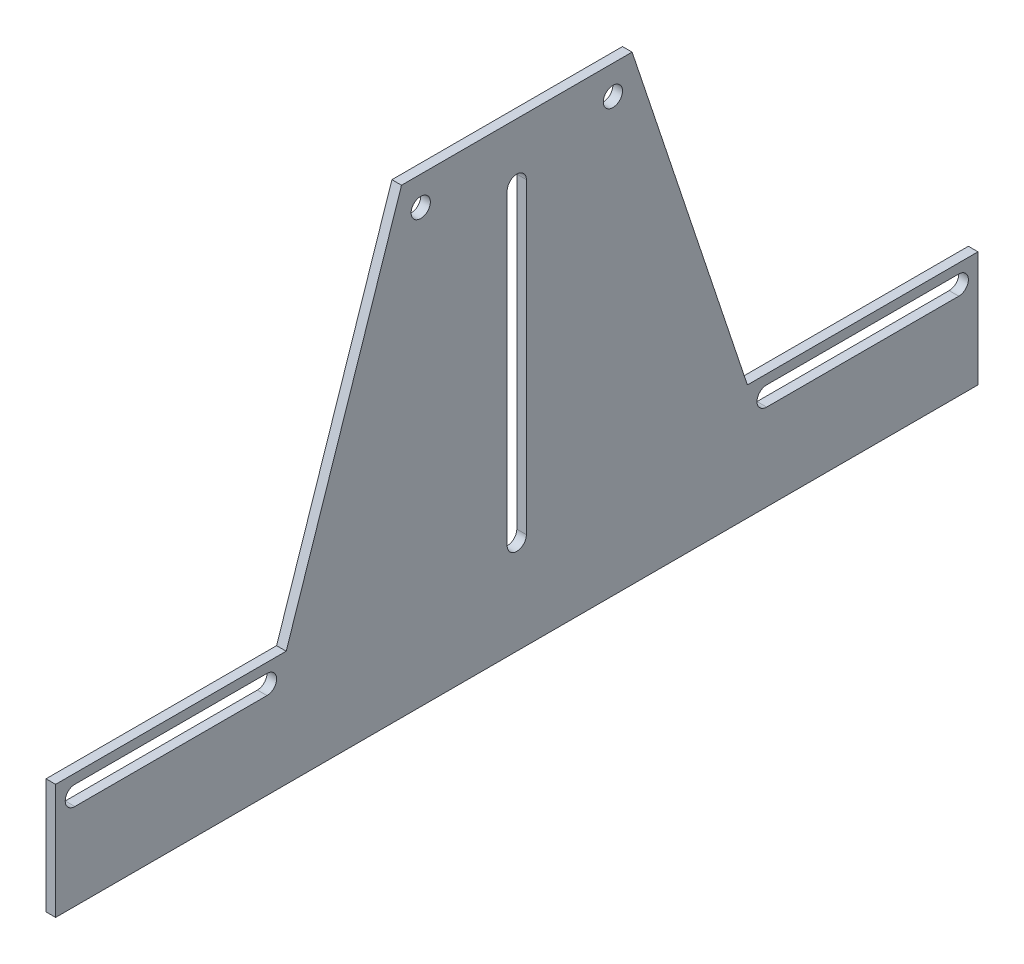
ISO-10303-21;
HEADER;
FILE_DESCRIPTION(('STEP AP214'),'2;1');
FILE_NAME('part.step','',(''),(''),'','','');
FILE_SCHEMA(('AUTOMOTIVE_DESIGN { 1 0 10303 214 1 1 1 1 }'));
ENDSEC;
DATA;
#1=APPLICATION_CONTEXT('core data for automotive mechanical design processes');
#2=APPLICATION_PROTOCOL_DEFINITION('international standard','automotive_design',2000,#1);
#3=PRODUCT_CONTEXT('',#1,'mechanical');
#4=PRODUCT('Part','Part','',(#3));
#5=PRODUCT_RELATED_PRODUCT_CATEGORY('part','',(#4));
#6=PRODUCT_DEFINITION_FORMATION('','',#4);
#7=PRODUCT_DEFINITION_CONTEXT('part definition',#1,'design');
#8=PRODUCT_DEFINITION('design','',#6,#7);
#9=PRODUCT_DEFINITION_SHAPE('','',#8);
#10=(LENGTH_UNIT() NAMED_UNIT(*) SI_UNIT(.MILLI.,.METRE.));
#11=(NAMED_UNIT(*) PLANE_ANGLE_UNIT() SI_UNIT($,.RADIAN.));
#12=(NAMED_UNIT(*) SI_UNIT($,.STERADIAN.) SOLID_ANGLE_UNIT());
#13=UNCERTAINTY_MEASURE_WITH_UNIT(LENGTH_MEASURE(1.E-05),#10,'distance_accuracy_value','');
#14=(GEOMETRIC_REPRESENTATION_CONTEXT(3) GLOBAL_UNCERTAINTY_ASSIGNED_CONTEXT((#13)) GLOBAL_UNIT_ASSIGNED_CONTEXT((#10,
#11,#12)) REPRESENTATION_CONTEXT('',''));
#15=CARTESIAN_POINT('',(0.,0.,0.));
#16=DIRECTION('',(0.,0.,1.));
#17=DIRECTION('',(1.,0.,0.));
#18=AXIS2_PLACEMENT_3D('',#15,#16,#17);
#19=CARTESIAN_POINT('',(6.35,0.,-304.8));
#20=DIRECTION('',(-1.,0.,0.));
#21=DIRECTION('',(0.,0.,1.));
#22=AXIS2_PLACEMENT_3D('',#19,#20,#21);
#23=PLANE('',#22);
#24=CARTESIAN_POINT('',(6.35,285.75,63.5));
#25=DIRECTION('',(1.,0.,0.));
#26=DIRECTION('',(0.,0.,-1.));
#27=AXIS2_PLACEMENT_3D('',#24,#25,#26);
#28=CIRCLE('',#27,6.35);
#29=CARTESIAN_POINT('',(6.35,285.75,57.15));
#30=VERTEX_POINT('',#29);
#31=EDGE_CURVE('E198',#30,#30,#28,.T.);
#32=ORIENTED_EDGE('',*,*,#31,.F.);
#33=EDGE_LOOP('',(#32));
#34=FACE_BOUND('',#33,.T.);
#35=CARTESIAN_POINT('',(6.35,63.5,-292.1));
#36=DIRECTION('',(1.,0.,0.));
#37=DIRECTION('',(0.,0.,1.));
#38=AXIS2_PLACEMENT_3D('',#35,#36,#37);
#39=CIRCLE('',#38,6.35000000000006);
#40=CARTESIAN_POINT('',(6.35,57.1499999999999,-292.1));
#41=VERTEX_POINT('',#40);
#42=CARTESIAN_POINT('',(6.35,69.85,-292.1));
#43=VERTEX_POINT('',#42);
#44=EDGE_CURVE('E208',#41,#43,#39,.T.);
#45=ORIENTED_EDGE('',*,*,#44,.F.);
#46=DIRECTION('',(0.,0.,-1.));
#47=VECTOR('',#46,1.);
#48=CARTESIAN_POINT('',(6.35,57.1499999999999,-292.1));
#49=LINE('',#48,#47);
#50=CARTESIAN_POINT('',(6.35,57.1499999999999,-165.1));
#51=VERTEX_POINT('',#50);
#52=EDGE_CURVE('E216',#51,#41,#49,.T.);
#53=ORIENTED_EDGE('',*,*,#52,.F.);
#54=CARTESIAN_POINT('',(6.35,63.5,-165.1));
#55=DIRECTION('',(1.,0.,0.));
#56=DIRECTION('',(0.,0.,1.));
#57=AXIS2_PLACEMENT_3D('',#54,#55,#56);
#58=CIRCLE('',#57,6.35000000000005);
#59=CARTESIAN_POINT('',(6.35,69.85,-165.1));
#60=VERTEX_POINT('',#59);
#61=EDGE_CURVE('E213',#60,#51,#58,.T.);
#62=ORIENTED_EDGE('',*,*,#61,.F.);
#63=DIRECTION('',(0.,0.,1.));
#64=VECTOR('',#63,1.);
#65=CARTESIAN_POINT('',(6.35,69.85,-292.1));
#66=LINE('',#65,#64);
#67=EDGE_CURVE('E210',#43,#60,#66,.T.);
#68=ORIENTED_EDGE('',*,*,#67,.F.);
#69=EDGE_LOOP('',(#45,#53,#62,#68));
#70=FACE_BOUND('',#69,.T.);
#71=DIRECTION('',(0.,1.,0.));
#72=VECTOR('',#71,1.);
#73=CARTESIAN_POINT('',(6.35,76.2,-304.8));
#74=LINE('',#73,#72);
#75=CARTESIAN_POINT('',(6.35,0.,-304.8));
#76=VERTEX_POINT('',#75);
#77=CARTESIAN_POINT('',(6.35,76.2,-304.8));
#78=VERTEX_POINT('',#77);
#79=EDGE_CURVE('E270',#76,#78,#74,.T.);
#80=ORIENTED_EDGE('',*,*,#79,.T.);
#81=DIRECTION('',(0.,0.,1.));
#82=VECTOR('',#81,1.);
#83=CARTESIAN_POINT('',(6.35,76.2,-152.4));
#84=LINE('',#83,#82);
#85=CARTESIAN_POINT('',(6.35,76.2,-152.4));
#86=VERTEX_POINT('',#85);
#87=EDGE_CURVE('E273',#78,#86,#84,.T.);
#88=ORIENTED_EDGE('',*,*,#87,.T.);
#89=DIRECTION('',(0.,0.948683298050514,0.316227766016838));
#90=VECTOR('',#89,1.);
#91=CARTESIAN_POINT('',(6.35,304.8,-76.2));
#92=LINE('',#91,#90);
#93=CARTESIAN_POINT('',(6.35,304.8,-76.2));
#94=VERTEX_POINT('',#93);
#95=EDGE_CURVE('E276',#86,#94,#92,.T.);
#96=ORIENTED_EDGE('',*,*,#95,.T.);
#97=DIRECTION('',(0.,0.,1.));
#98=VECTOR('',#97,1.);
#99=CARTESIAN_POINT('',(6.35,304.8,76.2));
#100=LINE('',#99,#98);
#101=CARTESIAN_POINT('',(6.35,304.8,76.2));
#102=VERTEX_POINT('',#101);
#103=EDGE_CURVE('E278',#94,#102,#100,.T.);
#104=ORIENTED_EDGE('',*,*,#103,.T.);
#105=DIRECTION('',(0.,-0.948683298050514,0.316227766016838));
#106=VECTOR('',#105,1.);
#107=CARTESIAN_POINT('',(6.35,76.1999999999999,152.4));
#108=LINE('',#107,#106);
#109=CARTESIAN_POINT('',(6.35,76.1999999999999,152.4));
#110=VERTEX_POINT('',#109);
#111=EDGE_CURVE('E280',#102,#110,#108,.T.);
#112=ORIENTED_EDGE('',*,*,#111,.T.);
#113=DIRECTION('',(0.,0.,1.));
#114=VECTOR('',#113,1.);
#115=CARTESIAN_POINT('',(6.35,76.1999999999999,304.8));
#116=LINE('',#115,#114);
#117=CARTESIAN_POINT('',(6.35,76.1999999999999,304.8));
#118=VERTEX_POINT('',#117);
#119=EDGE_CURVE('E282',#110,#118,#116,.T.);
#120=ORIENTED_EDGE('',*,*,#119,.T.);
#121=DIRECTION('',(0.,-1.,0.));
#122=VECTOR('',#121,1.);
#123=CARTESIAN_POINT('',(6.35,0.,304.8));
#124=LINE('',#123,#122);
#125=CARTESIAN_POINT('',(6.35,0.,304.8));
#126=VERTEX_POINT('',#125);
#127=EDGE_CURVE('E284',#118,#126,#124,.T.);
#128=ORIENTED_EDGE('',*,*,#127,.T.);
#129=DIRECTION('',(0.,0.,-1.));
#130=VECTOR('',#129,1.);
#131=CARTESIAN_POINT('',(6.35,0.,-304.8));
#132=LINE('',#131,#130);
#133=EDGE_CURVE('E286',#126,#76,#132,.T.);
#134=ORIENTED_EDGE('',*,*,#133,.T.);
#135=EDGE_LOOP('',(#80,#88,#96,#104,#112,#120,#128,#134));
#136=FACE_BOUND('',#135,.T.);
#137=CARTESIAN_POINT('',(6.35,63.4999999999999,292.1));
#138=DIRECTION('',(1.,0.,0.));
#139=DIRECTION('',(0.,0.,-1.));
#140=AXIS2_PLACEMENT_3D('',#137,#138,#139);
#141=CIRCLE('',#140,6.35000000000006);
#142=CARTESIAN_POINT('',(6.35,69.8499999999999,292.1));
#143=VERTEX_POINT('',#142);
#144=CARTESIAN_POINT('',(6.35,57.1499999999998,292.1));
#145=VERTEX_POINT('',#144);
#146=EDGE_CURVE('E239',#143,#145,#141,.T.);
#147=ORIENTED_EDGE('',*,*,#146,.F.);
#148=DIRECTION('',(0.,0.,1.));
#149=VECTOR('',#148,1.);
#150=CARTESIAN_POINT('',(6.35,69.8499999999999,292.1));
#151=LINE('',#150,#149);
#152=CARTESIAN_POINT('',(6.35,69.8499999999999,165.1));
#153=VERTEX_POINT('',#152);
#154=EDGE_CURVE('E247',#153,#143,#151,.T.);
#155=ORIENTED_EDGE('',*,*,#154,.F.);
#156=CARTESIAN_POINT('',(6.35,63.4999999999999,165.1));
#157=DIRECTION('',(1.,0.,0.));
#158=DIRECTION('',(0.,0.,-1.));
#159=AXIS2_PLACEMENT_3D('',#156,#157,#158);
#160=CIRCLE('',#159,6.35000000000005);
#161=CARTESIAN_POINT('',(6.35,57.1499999999999,165.1));
#162=VERTEX_POINT('',#161);
#163=EDGE_CURVE('E244',#162,#153,#160,.T.);
#164=ORIENTED_EDGE('',*,*,#163,.F.);
#165=DIRECTION('',(0.,0.,-1.));
#166=VECTOR('',#165,1.);
#167=CARTESIAN_POINT('',(6.35,57.1499999999998,292.1));
#168=LINE('',#167,#166);
#169=EDGE_CURVE('E241',#145,#162,#168,.T.);
#170=ORIENTED_EDGE('',*,*,#169,.F.);
#171=EDGE_LOOP('',(#147,#155,#164,#170));
#172=FACE_BOUND('',#171,.T.);
#173=CARTESIAN_POINT('',(6.35,266.7,0.));
#174=DIRECTION('',(1.,0.,0.));
#175=DIRECTION('',(0.,0.,-1.));
#176=AXIS2_PLACEMENT_3D('',#173,#174,#175);
#177=CIRCLE('',#176,6.35);
#178=CARTESIAN_POINT('',(6.35,266.7,-6.35000000000002));
#179=VERTEX_POINT('',#178);
#180=CARTESIAN_POINT('',(6.35,266.7,6.34999999999998));
#181=VERTEX_POINT('',#180);
#182=EDGE_CURVE('E169',#179,#181,#177,.T.);
#183=ORIENTED_EDGE('',*,*,#182,.F.);
#184=DIRECTION('',(0.,1.,0.));
#185=VECTOR('',#184,1.);
#186=CARTESIAN_POINT('',(6.35,266.7,-6.35000000000002));
#187=LINE('',#186,#185);
#188=CARTESIAN_POINT('',(6.35,63.4999999999999,-6.35000000000007));
#189=VERTEX_POINT('',#188);
#190=EDGE_CURVE('E192',#189,#179,#187,.T.);
#191=ORIENTED_EDGE('',*,*,#190,.F.);
#192=CARTESIAN_POINT('',(6.35,63.4999999999999,0.));
#193=DIRECTION('',(1.,0.,0.));
#194=DIRECTION('',(0.,0.,-1.));
#195=AXIS2_PLACEMENT_3D('',#192,#193,#194);
#196=CIRCLE('',#195,6.35);
#197=CARTESIAN_POINT('',(6.35,63.4999999999999,6.34999999999995));
#198=VERTEX_POINT('',#197);
#199=EDGE_CURVE('E190',#198,#189,#196,.T.);
#200=ORIENTED_EDGE('',*,*,#199,.F.);
#201=DIRECTION('',(0.,-1.,0.));
#202=VECTOR('',#201,1.);
#203=CARTESIAN_POINT('',(6.35,266.7,6.34999999999998));
#204=LINE('',#203,#202);
#205=EDGE_CURVE('E177',#181,#198,#204,.T.);
#206=ORIENTED_EDGE('',*,*,#205,.F.);
#207=EDGE_LOOP('',(#183,#191,#200,#206));
#208=FACE_BOUND('',#207,.T.);
#209=CARTESIAN_POINT('',(6.35,285.75,-63.5));
#210=DIRECTION('',(1.,0.,0.));
#211=DIRECTION('',(0.,0.,1.));
#212=AXIS2_PLACEMENT_3D('',#209,#210,#211);
#213=CIRCLE('',#212,6.34999999999999);
#214=CARTESIAN_POINT('',(6.35,285.75,-57.15));
#215=VERTEX_POINT('',#214);
#216=EDGE_CURVE('E455',#215,#215,#213,.T.);
#217=ORIENTED_EDGE('',*,*,#216,.F.);
#218=EDGE_LOOP('',(#217));
#219=FACE_BOUND('',#218,.T.);
#220=ADVANCED_FACE('F32',(#34,#70,#136,#172,#208,#219),#23,.F.);
#221=CARTESIAN_POINT('',(0.,0.,-304.8));
#222=DIRECTION('',(-1.,0.,0.));
#223=DIRECTION('',(0.,0.,1.));
#224=AXIS2_PLACEMENT_3D('',#221,#222,#223);
#225=PLANE('',#224);
#226=CARTESIAN_POINT('',(0.,285.75,63.5));
#227=DIRECTION('',(1.,0.,0.));
#228=DIRECTION('',(0.,0.,-1.));
#229=AXIS2_PLACEMENT_3D('',#226,#227,#228);
#230=CIRCLE('',#229,6.35);
#231=CARTESIAN_POINT('',(0.,285.75,57.15));
#232=VERTEX_POINT('',#231);
#233=EDGE_CURVE('E461',#232,#232,#230,.T.);
#234=ORIENTED_EDGE('',*,*,#233,.T.);
#235=EDGE_LOOP('',(#234));
#236=FACE_BOUND('',#235,.T.);
#237=DIRECTION('',(0.,0.,-1.));
#238=VECTOR('',#237,1.);
#239=CARTESIAN_POINT('',(0.,57.1499999999999,-292.1));
#240=LINE('',#239,#238);
#241=CARTESIAN_POINT('',(0.,57.1499999999999,-165.1));
#242=VERTEX_POINT('',#241);
#243=CARTESIAN_POINT('',(0.,57.1499999999999,-292.1));
#244=VERTEX_POINT('',#243);
#245=EDGE_CURVE('E211',#242,#244,#240,.T.);
#246=ORIENTED_EDGE('',*,*,#245,.T.);
#247=CARTESIAN_POINT('',(0.,63.5,-292.1));
#248=DIRECTION('',(1.,0.,0.));
#249=DIRECTION('',(0.,0.,1.));
#250=AXIS2_PLACEMENT_3D('',#247,#248,#249);
#251=CIRCLE('',#250,6.35000000000006);
#252=CARTESIAN_POINT('',(0.,69.85,-292.1));
#253=VERTEX_POINT('',#252);
#254=EDGE_CURVE('E185',#244,#253,#251,.T.);
#255=ORIENTED_EDGE('',*,*,#254,.T.);
#256=DIRECTION('',(0.,0.,1.));
#257=VECTOR('',#256,1.);
#258=CARTESIAN_POINT('',(0.,69.85,-292.1));
#259=LINE('',#258,#257);
#260=CARTESIAN_POINT('',(0.,69.85,-165.1));
#261=VERTEX_POINT('',#260);
#262=EDGE_CURVE('E221',#253,#261,#259,.T.);
#263=ORIENTED_EDGE('',*,*,#262,.T.);
#264=CARTESIAN_POINT('',(0.,63.5,-165.1));
#265=DIRECTION('',(1.,0.,0.));
#266=DIRECTION('',(0.,0.,1.));
#267=AXIS2_PLACEMENT_3D('',#264,#265,#266);
#268=CIRCLE('',#267,6.35000000000005);
#269=EDGE_CURVE('E224',#261,#242,#268,.T.);
#270=ORIENTED_EDGE('',*,*,#269,.T.);
#271=EDGE_LOOP('',(#246,#255,#263,#270));
#272=FACE_BOUND('',#271,.T.);
#273=DIRECTION('',(0.,1.,0.));
#274=VECTOR('',#273,1.);
#275=CARTESIAN_POINT('',(0.,76.2,-304.8));
#276=LINE('',#275,#274);
#277=CARTESIAN_POINT('',(0.,0.,-304.8));
#278=VERTEX_POINT('',#277);
#279=CARTESIAN_POINT('',(0.,76.2,-304.8));
#280=VERTEX_POINT('',#279);
#281=EDGE_CURVE('E269',#278,#280,#276,.T.);
#282=ORIENTED_EDGE('',*,*,#281,.F.);
#283=DIRECTION('',(0.,0.,-1.));
#284=VECTOR('',#283,1.);
#285=CARTESIAN_POINT('',(0.,0.,-304.8));
#286=LINE('',#285,#284);
#287=CARTESIAN_POINT('',(0.,0.,304.8));
#288=VERTEX_POINT('',#287);
#289=EDGE_CURVE('E274',#288,#278,#286,.T.);
#290=ORIENTED_EDGE('',*,*,#289,.F.);
#291=DIRECTION('',(0.,-1.,0.));
#292=VECTOR('',#291,1.);
#293=CARTESIAN_POINT('',(0.,0.,304.8));
#294=LINE('',#293,#292);
#295=CARTESIAN_POINT('',(0.,76.1999999999999,304.8));
#296=VERTEX_POINT('',#295);
#297=EDGE_CURVE('E301',#296,#288,#294,.T.);
#298=ORIENTED_EDGE('',*,*,#297,.F.);
#299=DIRECTION('',(0.,0.,1.));
#300=VECTOR('',#299,1.);
#301=CARTESIAN_POINT('',(0.,76.1999999999999,304.8));
#302=LINE('',#301,#300);
#303=CARTESIAN_POINT('',(0.,76.1999999999999,152.4));
#304=VERTEX_POINT('',#303);
#305=EDGE_CURVE('E299',#304,#296,#302,.T.);
#306=ORIENTED_EDGE('',*,*,#305,.F.);
#307=DIRECTION('',(0.,-0.948683298050514,0.316227766016838));
#308=VECTOR('',#307,1.);
#309=CARTESIAN_POINT('',(0.,76.1999999999999,152.4));
#310=LINE('',#309,#308);
#311=CARTESIAN_POINT('',(0.,304.8,76.2));
#312=VERTEX_POINT('',#311);
#313=EDGE_CURVE('E297',#312,#304,#310,.T.);
#314=ORIENTED_EDGE('',*,*,#313,.F.);
#315=DIRECTION('',(0.,0.,1.));
#316=VECTOR('',#315,1.);
#317=CARTESIAN_POINT('',(0.,304.8,76.2));
#318=LINE('',#317,#316);
#319=CARTESIAN_POINT('',(0.,304.8,-76.2));
#320=VERTEX_POINT('',#319);
#321=EDGE_CURVE('E295',#320,#312,#318,.T.);
#322=ORIENTED_EDGE('',*,*,#321,.F.);
#323=DIRECTION('',(0.,0.948683298050514,0.316227766016838));
#324=VECTOR('',#323,1.);
#325=CARTESIAN_POINT('',(0.,304.8,-76.2));
#326=LINE('',#325,#324);
#327=CARTESIAN_POINT('',(0.,76.2,-152.4));
#328=VERTEX_POINT('',#327);
#329=EDGE_CURVE('E293',#328,#320,#326,.T.);
#330=ORIENTED_EDGE('',*,*,#329,.F.);
#331=DIRECTION('',(0.,0.,1.));
#332=VECTOR('',#331,1.);
#333=CARTESIAN_POINT('',(0.,76.2,-152.4));
#334=LINE('',#333,#332);
#335=EDGE_CURVE('E291',#280,#328,#334,.T.);
#336=ORIENTED_EDGE('',*,*,#335,.F.);
#337=EDGE_LOOP('',(#282,#290,#298,#306,#314,#322,#330,#336));
#338=FACE_BOUND('',#337,.T.);
#339=DIRECTION('',(0.,0.,1.));
#340=VECTOR('',#339,1.);
#341=CARTESIAN_POINT('',(0.,69.8499999999999,292.1));
#342=LINE('',#341,#340);
#343=CARTESIAN_POINT('',(0.,69.8499999999999,165.1));
#344=VERTEX_POINT('',#343);
#345=CARTESIAN_POINT('',(0.,69.8499999999999,292.1));
#346=VERTEX_POINT('',#345);
#347=EDGE_CURVE('E242',#344,#346,#342,.T.);
#348=ORIENTED_EDGE('',*,*,#347,.T.);
#349=CARTESIAN_POINT('',(0.,63.4999999999999,292.1));
#350=DIRECTION('',(1.,0.,0.));
#351=DIRECTION('',(0.,0.,-1.));
#352=AXIS2_PLACEMENT_3D('',#349,#350,#351);
#353=CIRCLE('',#352,6.35000000000006);
#354=CARTESIAN_POINT('',(0.,57.1499999999998,292.1));
#355=VERTEX_POINT('',#354);
#356=EDGE_CURVE('E238',#346,#355,#353,.T.);
#357=ORIENTED_EDGE('',*,*,#356,.T.);
#358=DIRECTION('',(0.,0.,-1.));
#359=VECTOR('',#358,1.);
#360=CARTESIAN_POINT('',(0.,57.1499999999998,292.1));
#361=LINE('',#360,#359);
#362=CARTESIAN_POINT('',(0.,57.1499999999999,165.1));
#363=VERTEX_POINT('',#362);
#364=EDGE_CURVE('E252',#355,#363,#361,.T.);
#365=ORIENTED_EDGE('',*,*,#364,.T.);
#366=CARTESIAN_POINT('',(0.,63.4999999999999,165.1));
#367=DIRECTION('',(1.,0.,0.));
#368=DIRECTION('',(0.,0.,-1.));
#369=AXIS2_PLACEMENT_3D('',#366,#367,#368);
#370=CIRCLE('',#369,6.35000000000005);
#371=EDGE_CURVE('E255',#363,#344,#370,.T.);
#372=ORIENTED_EDGE('',*,*,#371,.T.);
#373=EDGE_LOOP('',(#348,#357,#365,#372));
#374=FACE_BOUND('',#373,.T.);
#375=DIRECTION('',(0.,1.,0.));
#376=VECTOR('',#375,1.);
#377=CARTESIAN_POINT('',(0.,266.7,-6.35000000000002));
#378=LINE('',#377,#376);
#379=CARTESIAN_POINT('',(0.,63.4999999999999,-6.35000000000005));
#380=VERTEX_POINT('',#379);
#381=CARTESIAN_POINT('',(0.,266.7,-6.35000000000005));
#382=VERTEX_POINT('',#381);
#383=EDGE_CURVE('E178',#380,#382,#378,.T.);
#384=ORIENTED_EDGE('',*,*,#383,.T.);
#385=CARTESIAN_POINT('',(0.,266.7,0.));
#386=DIRECTION('',(1.,0.,0.));
#387=DIRECTION('',(0.,0.,-1.));
#388=AXIS2_PLACEMENT_3D('',#385,#386,#387);
#389=CIRCLE('',#388,6.35);
#390=CARTESIAN_POINT('',(0.,266.7,6.34999999999998));
#391=VERTEX_POINT('',#390);
#392=EDGE_CURVE('E55',#382,#391,#389,.T.);
#393=ORIENTED_EDGE('',*,*,#392,.T.);
#394=DIRECTION('',(0.,-1.,0.));
#395=VECTOR('',#394,1.);
#396=CARTESIAN_POINT('',(0.,266.7,6.34999999999998));
#397=LINE('',#396,#395);
#398=CARTESIAN_POINT('',(0.,63.4999999999999,6.34999999999995));
#399=VERTEX_POINT('',#398);
#400=EDGE_CURVE('E184',#391,#399,#397,.T.);
#401=ORIENTED_EDGE('',*,*,#400,.T.);
#402=CARTESIAN_POINT('',(0.,63.4999999999999,0.));
#403=DIRECTION('',(1.,0.,0.));
#404=DIRECTION('',(0.,0.,-1.));
#405=AXIS2_PLACEMENT_3D('',#402,#403,#404);
#406=CIRCLE('',#405,6.35);
#407=EDGE_CURVE('E200',#399,#380,#406,.T.);
#408=ORIENTED_EDGE('',*,*,#407,.T.);
#409=EDGE_LOOP('',(#384,#393,#401,#408));
#410=FACE_BOUND('',#409,.T.);
#411=CARTESIAN_POINT('',(0.,285.75,-63.5));
#412=DIRECTION('',(1.,0.,0.));
#413=DIRECTION('',(0.,0.,1.));
#414=AXIS2_PLACEMENT_3D('',#411,#412,#413);
#415=CIRCLE('',#414,6.34999999999999);
#416=CARTESIAN_POINT('',(0.,285.75,-57.15));
#417=VERTEX_POINT('',#416);
#418=EDGE_CURVE('E458',#417,#417,#415,.T.);
#419=ORIENTED_EDGE('',*,*,#418,.T.);
#420=EDGE_LOOP('',(#419));
#421=FACE_BOUND('',#420,.T.);
#422=ADVANCED_FACE('F331',(#236,#272,#338,#374,#410,#421),#225,.T.);
#423=CARTESIAN_POINT('',(6.35,76.2,-304.8));
#424=DIRECTION('',(0.,0.,1.));
#425=DIRECTION('',(1.,0.,0.));
#426=AXIS2_PLACEMENT_3D('',#423,#424,#425);
#427=PLANE('',#426);
#428=ORIENTED_EDGE('',*,*,#281,.T.);
#429=DIRECTION('',(-1.,0.,0.));
#430=VECTOR('',#429,1.);
#431=CARTESIAN_POINT('',(6.35,76.2,-304.8));
#432=LINE('',#431,#430);
#433=EDGE_CURVE('E11',#78,#280,#432,.T.);
#434=ORIENTED_EDGE('',*,*,#433,.F.);
#435=ORIENTED_EDGE('',*,*,#79,.F.);
#436=DIRECTION('',(-1.,0.,0.));
#437=VECTOR('',#436,1.);
#438=CARTESIAN_POINT('',(6.35,0.,-304.8));
#439=LINE('',#438,#437);
#440=EDGE_CURVE('E288',#76,#278,#439,.T.);
#441=ORIENTED_EDGE('',*,*,#440,.T.);
#442=EDGE_LOOP('',(#428,#434,#435,#441));
#443=FACE_BOUND('',#442,.T.);
#444=ADVANCED_FACE('F34',(#443),#427,.F.);
#445=CARTESIAN_POINT('',(6.35,76.2,-152.4));
#446=DIRECTION('',(0.,-1.,0.));
#447=DIRECTION('',(0.,0.,-1.));
#448=AXIS2_PLACEMENT_3D('',#445,#446,#447);
#449=PLANE('',#448);
#450=ORIENTED_EDGE('',*,*,#335,.T.);
#451=DIRECTION('',(-1.,0.,0.));
#452=VECTOR('',#451,1.);
#453=CARTESIAN_POINT('',(6.35,76.2,-152.4));
#454=LINE('',#453,#452);
#455=EDGE_CURVE('E40',#86,#328,#454,.T.);
#456=ORIENTED_EDGE('',*,*,#455,.F.);
#457=ORIENTED_EDGE('',*,*,#87,.F.);
#458=ORIENTED_EDGE('',*,*,#433,.T.);
#459=EDGE_LOOP('',(#450,#456,#457,#458));
#460=FACE_BOUND('',#459,.T.);
#461=ADVANCED_FACE('F349',(#460),#449,.F.);
#462=CARTESIAN_POINT('',(6.35,304.8,-76.2));
#463=DIRECTION('',(0.,-0.316227766016838,0.948683298050514));
#464=DIRECTION('',(0.,-0.948683298050514,-0.316227766016838));
#465=AXIS2_PLACEMENT_3D('',#462,#463,#464);
#466=PLANE('',#465);
#467=ORIENTED_EDGE('',*,*,#329,.T.);
#468=DIRECTION('',(-1.,0.,0.));
#469=VECTOR('',#468,1.);
#470=CARTESIAN_POINT('',(6.35,304.8,-76.2));
#471=LINE('',#470,#469);
#472=EDGE_CURVE('E318',#94,#320,#471,.T.);
#473=ORIENTED_EDGE('',*,*,#472,.F.);
#474=ORIENTED_EDGE('',*,*,#95,.F.);
#475=ORIENTED_EDGE('',*,*,#455,.T.);
#476=EDGE_LOOP('',(#467,#473,#474,#475));
#477=FACE_BOUND('',#476,.T.);
#478=ADVANCED_FACE('F325',(#477),#466,.F.);
#479=CARTESIAN_POINT('',(6.35,304.8,76.2));
#480=DIRECTION('',(0.,-1.,0.));
#481=DIRECTION('',(0.,0.,-1.));
#482=AXIS2_PLACEMENT_3D('',#479,#480,#481);
#483=PLANE('',#482);
#484=ORIENTED_EDGE('',*,*,#321,.T.);
#485=DIRECTION('',(-1.,0.,0.));
#486=VECTOR('',#485,1.);
#487=CARTESIAN_POINT('',(6.35,304.8,76.2));
#488=LINE('',#487,#486);
#489=EDGE_CURVE('E315',#102,#312,#488,.T.);
#490=ORIENTED_EDGE('',*,*,#489,.F.);
#491=ORIENTED_EDGE('',*,*,#103,.F.);
#492=ORIENTED_EDGE('',*,*,#472,.T.);
#493=EDGE_LOOP('',(#484,#490,#491,#492));
#494=FACE_BOUND('',#493,.T.);
#495=ADVANCED_FACE('F337',(#494),#483,.F.);
#496=CARTESIAN_POINT('',(6.35,76.1999999999999,152.4));
#497=DIRECTION('',(0.,-0.316227766016838,-0.948683298050514));
#498=DIRECTION('',(0.,0.948683298050514,-0.316227766016838));
#499=AXIS2_PLACEMENT_3D('',#496,#497,#498);
#500=PLANE('',#499);
#501=ORIENTED_EDGE('',*,*,#313,.T.);
#502=DIRECTION('',(-1.,0.,0.));
#503=VECTOR('',#502,1.);
#504=CARTESIAN_POINT('',(6.35,76.1999999999999,152.4));
#505=LINE('',#504,#503);
#506=EDGE_CURVE('E312',#110,#304,#505,.T.);
#507=ORIENTED_EDGE('',*,*,#506,.F.);
#508=ORIENTED_EDGE('',*,*,#111,.F.);
#509=ORIENTED_EDGE('',*,*,#489,.T.);
#510=EDGE_LOOP('',(#501,#507,#508,#509));
#511=FACE_BOUND('',#510,.T.);
#512=ADVANCED_FACE('F341',(#511),#500,.F.);
#513=CARTESIAN_POINT('',(6.35,76.1999999999999,304.8));
#514=DIRECTION('',(0.,-1.,0.));
#515=DIRECTION('',(0.,0.,-1.));
#516=AXIS2_PLACEMENT_3D('',#513,#514,#515);
#517=PLANE('',#516);
#518=ORIENTED_EDGE('',*,*,#305,.T.);
#519=DIRECTION('',(-1.,0.,0.));
#520=VECTOR('',#519,1.);
#521=CARTESIAN_POINT('',(6.35,76.1999999999999,304.8));
#522=LINE('',#521,#520);
#523=EDGE_CURVE('E309',#118,#296,#522,.T.);
#524=ORIENTED_EDGE('',*,*,#523,.F.);
#525=ORIENTED_EDGE('',*,*,#119,.F.);
#526=ORIENTED_EDGE('',*,*,#506,.T.);
#527=EDGE_LOOP('',(#518,#524,#525,#526));
#528=FACE_BOUND('',#527,.T.);
#529=ADVANCED_FACE('F362',(#528),#517,.F.);
#530=CARTESIAN_POINT('',(6.35,0.,304.8));
#531=DIRECTION('',(0.,0.,-1.));
#532=DIRECTION('',(-1.,0.,0.));
#533=AXIS2_PLACEMENT_3D('',#530,#531,#532);
#534=PLANE('',#533);
#535=ORIENTED_EDGE('',*,*,#297,.T.);
#536=DIRECTION('',(-1.,0.,0.));
#537=VECTOR('',#536,1.);
#538=CARTESIAN_POINT('',(6.35,0.,304.8));
#539=LINE('',#538,#537);
#540=EDGE_CURVE('E306',#126,#288,#539,.T.);
#541=ORIENTED_EDGE('',*,*,#540,.F.);
#542=ORIENTED_EDGE('',*,*,#127,.F.);
#543=ORIENTED_EDGE('',*,*,#523,.T.);
#544=EDGE_LOOP('',(#535,#541,#542,#543));
#545=FACE_BOUND('',#544,.T.);
#546=ADVANCED_FACE('F360',(#545),#534,.F.);
#547=CARTESIAN_POINT('',(6.35,0.,-304.8));
#548=DIRECTION('',(0.,1.,0.));
#549=DIRECTION('',(0.,0.,1.));
#550=AXIS2_PLACEMENT_3D('',#547,#548,#549);
#551=PLANE('',#550);
#552=ORIENTED_EDGE('',*,*,#289,.T.);
#553=ORIENTED_EDGE('',*,*,#440,.F.);
#554=ORIENTED_EDGE('',*,*,#133,.F.);
#555=ORIENTED_EDGE('',*,*,#540,.T.);
#556=EDGE_LOOP('',(#552,#553,#554,#555));
#557=FACE_BOUND('',#556,.T.);
#558=ADVANCED_FACE('F355',(#557),#551,.F.);
#559=CARTESIAN_POINT('',(6.35,63.4999999999999,292.1));
#560=DIRECTION('',(-1.,0.,0.));
#561=DIRECTION('',(0.,0.,1.));
#562=AXIS2_PLACEMENT_3D('',#559,#560,#561);
#563=CYLINDRICAL_SURFACE('',#562,6.35000000000006);
#564=ORIENTED_EDGE('',*,*,#356,.F.);
#565=DIRECTION('',(-1.,0.,0.));
#566=VECTOR('',#565,1.);
#567=CARTESIAN_POINT('',(6.35,69.8499999999999,292.1));
#568=LINE('',#567,#566);
#569=EDGE_CURVE('E249',#143,#346,#568,.T.);
#570=ORIENTED_EDGE('',*,*,#569,.F.);
#571=ORIENTED_EDGE('',*,*,#146,.T.);
#572=DIRECTION('',(-1.,0.,0.));
#573=VECTOR('',#572,1.);
#574=CARTESIAN_POINT('',(6.35,57.1499999999998,292.1));
#575=LINE('',#574,#573);
#576=EDGE_CURVE('E266',#145,#355,#575,.T.);
#577=ORIENTED_EDGE('',*,*,#576,.T.);
#578=EDGE_LOOP('',(#564,#570,#571,#577));
#579=FACE_BOUND('',#578,.T.);
#580=ADVANCED_FACE('F382',(#579),#563,.F.);
#581=CARTESIAN_POINT('',(6.35,57.1499999999998,292.1));
#582=DIRECTION('',(0.,1.,0.));
#583=DIRECTION('',(0.,0.,1.));
#584=AXIS2_PLACEMENT_3D('',#581,#582,#583);
#585=PLANE('',#584);
#586=ORIENTED_EDGE('',*,*,#364,.F.);
#587=ORIENTED_EDGE('',*,*,#576,.F.);
#588=ORIENTED_EDGE('',*,*,#169,.T.);
#589=DIRECTION('',(-1.,0.,0.));
#590=VECTOR('',#589,1.);
#591=CARTESIAN_POINT('',(6.35,57.1499999999999,165.1));
#592=LINE('',#591,#590);
#593=EDGE_CURVE('E264',#162,#363,#592,.T.);
#594=ORIENTED_EDGE('',*,*,#593,.T.);
#595=EDGE_LOOP('',(#586,#587,#588,#594));
#596=FACE_BOUND('',#595,.T.);
#597=ADVANCED_FACE('F389',(#596),#585,.T.);
#598=CARTESIAN_POINT('',(6.35,63.4999999999999,165.1));
#599=DIRECTION('',(-1.,0.,0.));
#600=DIRECTION('',(0.,0.,1.));
#601=AXIS2_PLACEMENT_3D('',#598,#599,#600);
#602=CYLINDRICAL_SURFACE('',#601,6.35000000000005);
#603=ORIENTED_EDGE('',*,*,#371,.F.);
#604=ORIENTED_EDGE('',*,*,#593,.F.);
#605=ORIENTED_EDGE('',*,*,#163,.T.);
#606=DIRECTION('',(-1.,0.,0.));
#607=VECTOR('',#606,1.);
#608=CARTESIAN_POINT('',(6.35,69.8499999999999,165.1));
#609=LINE('',#608,#607);
#610=EDGE_CURVE('E262',#153,#344,#609,.T.);
#611=ORIENTED_EDGE('',*,*,#610,.T.);
#612=EDGE_LOOP('',(#603,#604,#605,#611));
#613=FACE_BOUND('',#612,.T.);
#614=ADVANCED_FACE('F394',(#613),#602,.F.);
#615=CARTESIAN_POINT('',(6.35,69.8499999999999,292.1));
#616=DIRECTION('',(0.,-1.,0.));
#617=DIRECTION('',(0.,0.,-1.));
#618=AXIS2_PLACEMENT_3D('',#615,#616,#617);
#619=PLANE('',#618);
#620=ORIENTED_EDGE('',*,*,#347,.F.);
#621=ORIENTED_EDGE('',*,*,#610,.F.);
#622=ORIENTED_EDGE('',*,*,#154,.T.);
#623=ORIENTED_EDGE('',*,*,#569,.T.);
#624=EDGE_LOOP('',(#620,#621,#622,#623));
#625=FACE_BOUND('',#624,.T.);
#626=ADVANCED_FACE('F401',(#625),#619,.T.);
#627=CARTESIAN_POINT('',(6.35,63.5,-292.1));
#628=DIRECTION('',(-1.,0.,0.));
#629=DIRECTION('',(0.,0.,1.));
#630=AXIS2_PLACEMENT_3D('',#627,#628,#629);
#631=CYLINDRICAL_SURFACE('',#630,6.35000000000006);
#632=ORIENTED_EDGE('',*,*,#254,.F.);
#633=DIRECTION('',(-1.,0.,0.));
#634=VECTOR('',#633,1.);
#635=CARTESIAN_POINT('',(6.35,57.1499999999999,-292.1));
#636=LINE('',#635,#634);
#637=EDGE_CURVE('E218',#41,#244,#636,.T.);
#638=ORIENTED_EDGE('',*,*,#637,.F.);
#639=ORIENTED_EDGE('',*,*,#44,.T.);
#640=DIRECTION('',(-1.,0.,0.));
#641=VECTOR('',#640,1.);
#642=CARTESIAN_POINT('',(6.35,69.85,-292.1));
#643=LINE('',#642,#641);
#644=EDGE_CURVE('E235',#43,#253,#643,.T.);
#645=ORIENTED_EDGE('',*,*,#644,.T.);
#646=EDGE_LOOP('',(#632,#638,#639,#645));
#647=FACE_BOUND('',#646,.T.);
#648=ADVANCED_FACE('F414',(#647),#631,.F.);
#649=CARTESIAN_POINT('',(6.35,69.85,-292.1));
#650=DIRECTION('',(0.,-1.,0.));
#651=DIRECTION('',(0.,0.,-1.));
#652=AXIS2_PLACEMENT_3D('',#649,#650,#651);
#653=PLANE('',#652);
#654=ORIENTED_EDGE('',*,*,#262,.F.);
#655=ORIENTED_EDGE('',*,*,#644,.F.);
#656=ORIENTED_EDGE('',*,*,#67,.T.);
#657=DIRECTION('',(-1.,0.,0.));
#658=VECTOR('',#657,1.);
#659=CARTESIAN_POINT('',(6.35,69.85,-165.1));
#660=LINE('',#659,#658);
#661=EDGE_CURVE('E233',#60,#261,#660,.T.);
#662=ORIENTED_EDGE('',*,*,#661,.T.);
#663=EDGE_LOOP('',(#654,#655,#656,#662));
#664=FACE_BOUND('',#663,.T.);
#665=ADVANCED_FACE('F419',(#664),#653,.T.);
#666=CARTESIAN_POINT('',(6.35,63.5,-165.1));
#667=DIRECTION('',(-1.,0.,0.));
#668=DIRECTION('',(0.,0.,1.));
#669=AXIS2_PLACEMENT_3D('',#666,#667,#668);
#670=CYLINDRICAL_SURFACE('',#669,6.35000000000005);
#671=ORIENTED_EDGE('',*,*,#269,.F.);
#672=ORIENTED_EDGE('',*,*,#661,.F.);
#673=ORIENTED_EDGE('',*,*,#61,.T.);
#674=DIRECTION('',(-1.,0.,0.));
#675=VECTOR('',#674,1.);
#676=CARTESIAN_POINT('',(6.35,57.1499999999999,-165.1));
#677=LINE('',#676,#675);
#678=EDGE_CURVE('E231',#51,#242,#677,.T.);
#679=ORIENTED_EDGE('',*,*,#678,.T.);
#680=EDGE_LOOP('',(#671,#672,#673,#679));
#681=FACE_BOUND('',#680,.T.);
#682=ADVANCED_FACE('F423',(#681),#670,.F.);
#683=CARTESIAN_POINT('',(6.35,57.1499999999999,-292.1));
#684=DIRECTION('',(0.,1.,0.));
#685=DIRECTION('',(0.,0.,1.));
#686=AXIS2_PLACEMENT_3D('',#683,#684,#685);
#687=PLANE('',#686);
#688=ORIENTED_EDGE('',*,*,#245,.F.);
#689=ORIENTED_EDGE('',*,*,#678,.F.);
#690=ORIENTED_EDGE('',*,*,#52,.T.);
#691=ORIENTED_EDGE('',*,*,#637,.T.);
#692=EDGE_LOOP('',(#688,#689,#690,#691));
#693=FACE_BOUND('',#692,.T.);
#694=ADVANCED_FACE('F427',(#693),#687,.T.);
#695=CARTESIAN_POINT('',(6.35,266.7,0.));
#696=DIRECTION('',(-1.,0.,0.));
#697=DIRECTION('',(0.,0.,1.));
#698=AXIS2_PLACEMENT_3D('',#695,#696,#697);
#699=CYLINDRICAL_SURFACE('',#698,6.35);
#700=ORIENTED_EDGE('',*,*,#392,.F.);
#701=DIRECTION('',(-1.,0.,0.));
#702=VECTOR('',#701,1.);
#703=CARTESIAN_POINT('',(6.35,266.7,-6.35000000000002));
#704=LINE('',#703,#702);
#705=EDGE_CURVE('E173',#179,#382,#704,.T.);
#706=ORIENTED_EDGE('',*,*,#705,.F.);
#707=ORIENTED_EDGE('',*,*,#182,.T.);
#708=DIRECTION('',(-1.,0.,0.));
#709=VECTOR('',#708,1.);
#710=CARTESIAN_POINT('',(6.35,266.7,6.34999999999998));
#711=LINE('',#710,#709);
#712=EDGE_CURVE('E172',#181,#391,#711,.T.);
#713=ORIENTED_EDGE('',*,*,#712,.T.);
#714=EDGE_LOOP('',(#700,#706,#707,#713));
#715=FACE_BOUND('',#714,.T.);
#716=ADVANCED_FACE('F171',(#715),#699,.F.);
#717=CARTESIAN_POINT('',(6.35,266.7,6.34999999999998));
#718=DIRECTION('',(0.,0.,-1.));
#719=DIRECTION('',(0.,1.,0.));
#720=AXIS2_PLACEMENT_3D('',#717,#718,#719);
#721=PLANE('',#720);
#722=ORIENTED_EDGE('',*,*,#400,.F.);
#723=ORIENTED_EDGE('',*,*,#712,.F.);
#724=ORIENTED_EDGE('',*,*,#205,.T.);
#725=DIRECTION('',(-1.,0.,0.));
#726=VECTOR('',#725,1.);
#727=CARTESIAN_POINT('',(6.35,63.4999999999999,6.34999999999995));
#728=LINE('',#727,#726);
#729=EDGE_CURVE('E186',#198,#399,#728,.T.);
#730=ORIENTED_EDGE('',*,*,#729,.T.);
#731=EDGE_LOOP('',(#722,#723,#724,#730));
#732=FACE_BOUND('',#731,.T.);
#733=ADVANCED_FACE('F181',(#732),#721,.T.);
#734=CARTESIAN_POINT('',(6.35,63.4999999999999,0.));
#735=DIRECTION('',(-1.,0.,0.));
#736=DIRECTION('',(0.,0.,1.));
#737=AXIS2_PLACEMENT_3D('',#734,#735,#736);
#738=CYLINDRICAL_SURFACE('',#737,6.35);
#739=ORIENTED_EDGE('',*,*,#407,.F.);
#740=ORIENTED_EDGE('',*,*,#729,.F.);
#741=ORIENTED_EDGE('',*,*,#199,.T.);
#742=DIRECTION('',(-1.,0.,0.));
#743=VECTOR('',#742,1.);
#744=CARTESIAN_POINT('',(6.35,63.4999999999999,-6.35000000000005));
#745=LINE('',#744,#743);
#746=EDGE_CURVE('E47',#189,#380,#745,.T.);
#747=ORIENTED_EDGE('',*,*,#746,.T.);
#748=EDGE_LOOP('',(#739,#740,#741,#747));
#749=FACE_BOUND('',#748,.T.);
#750=ADVANCED_FACE('F436',(#749),#738,.F.);
#751=CARTESIAN_POINT('',(6.35,266.7,-6.35000000000002));
#752=DIRECTION('',(0.,0.,1.));
#753=DIRECTION('',(0.,-1.,0.));
#754=AXIS2_PLACEMENT_3D('',#751,#752,#753);
#755=PLANE('',#754);
#756=ORIENTED_EDGE('',*,*,#383,.F.);
#757=ORIENTED_EDGE('',*,*,#746,.F.);
#758=ORIENTED_EDGE('',*,*,#190,.T.);
#759=ORIENTED_EDGE('',*,*,#705,.T.);
#760=EDGE_LOOP('',(#756,#757,#758,#759));
#761=FACE_BOUND('',#760,.T.);
#762=ADVANCED_FACE('F439',(#761),#755,.T.);
#763=CARTESIAN_POINT('',(6.35,285.75,63.5));
#764=DIRECTION('',(-1.,0.,0.));
#765=DIRECTION('',(0.,0.,1.));
#766=AXIS2_PLACEMENT_3D('',#763,#764,#765);
#767=CYLINDRICAL_SURFACE('',#766,6.35);
#768=ORIENTED_EDGE('',*,*,#31,.T.);
#769=EDGE_LOOP('',(#768));
#770=FACE_BOUND('',#769,.T.);
#771=ORIENTED_EDGE('',*,*,#233,.F.);
#772=EDGE_LOOP('',(#771));
#773=FACE_BOUND('',#772,.T.);
#774=ADVANCED_FACE('F443',(#770,#773),#767,.F.);
#775=CARTESIAN_POINT('',(6.35,285.75,-63.5));
#776=DIRECTION('',(-1.,0.,0.));
#777=DIRECTION('',(0.,0.,1.));
#778=AXIS2_PLACEMENT_3D('',#775,#776,#777);
#779=CYLINDRICAL_SURFACE('',#778,6.34999999999999);
#780=ORIENTED_EDGE('',*,*,#216,.T.);
#781=EDGE_LOOP('',(#780));
#782=FACE_BOUND('',#781,.T.);
#783=ORIENTED_EDGE('',*,*,#418,.F.);
#784=EDGE_LOOP('',(#783));
#785=FACE_BOUND('',#784,.T.);
#786=ADVANCED_FACE('F446',(#782,#785),#779,.F.);
#787=CLOSED_SHELL('',(#220,#422,#444,#461,#478,#495,#512,#529,#546,#558,#580,#597,#614,#626,
#648,#665,#682,#694,#716,#733,#750,#762,#774,#786));
#788=MANIFOLD_SOLID_BREP('B2',#787);
#789=ADVANCED_BREP_SHAPE_REPRESENTATION('',(#18,#788),#14);
#790=SHAPE_DEFINITION_REPRESENTATION(#9,#789);
ENDSEC;
END-ISO-10303-21;
